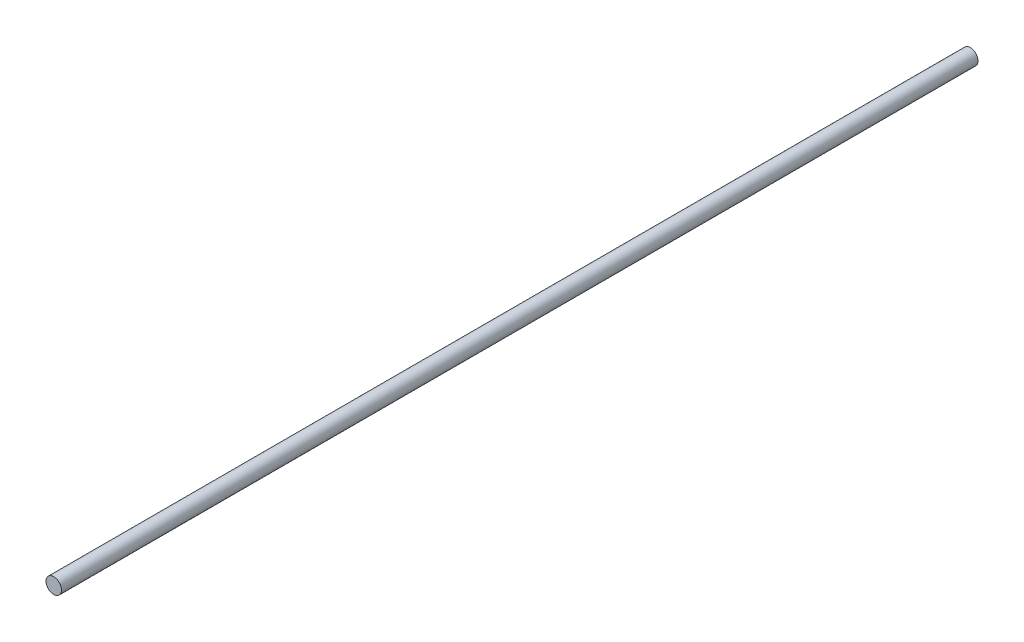
ISO-10303-21;
HEADER;
FILE_DESCRIPTION(('STEP AP214'),'2;1');
FILE_NAME('part.step','',(''),(''),'','','');
FILE_SCHEMA(('AUTOMOTIVE_DESIGN { 1 0 10303 214 1 1 1 1 }'));
ENDSEC;
DATA;
#1=APPLICATION_CONTEXT('core data for automotive mechanical design processes');
#2=APPLICATION_PROTOCOL_DEFINITION('international standard','automotive_design',2000,#1);
#3=PRODUCT_CONTEXT('',#1,'mechanical');
#4=PRODUCT('Part','Part','',(#3));
#5=PRODUCT_RELATED_PRODUCT_CATEGORY('part','',(#4));
#6=PRODUCT_DEFINITION_FORMATION('','',#4);
#7=PRODUCT_DEFINITION_CONTEXT('part definition',#1,'design');
#8=PRODUCT_DEFINITION('design','',#6,#7);
#9=PRODUCT_DEFINITION_SHAPE('','',#8);
#10=(LENGTH_UNIT() NAMED_UNIT(*) SI_UNIT(.MILLI.,.METRE.));
#11=(NAMED_UNIT(*) PLANE_ANGLE_UNIT() SI_UNIT($,.RADIAN.));
#12=(NAMED_UNIT(*) SI_UNIT($,.STERADIAN.) SOLID_ANGLE_UNIT());
#13=UNCERTAINTY_MEASURE_WITH_UNIT(LENGTH_MEASURE(1.E-05),#10,'distance_accuracy_value','');
#14=(GEOMETRIC_REPRESENTATION_CONTEXT(3) GLOBAL_UNCERTAINTY_ASSIGNED_CONTEXT((#13)) GLOBAL_UNIT_ASSIGNED_CONTEXT((#10,
#11,#12)) REPRESENTATION_CONTEXT('',''));
#15=CARTESIAN_POINT('',(0.,0.,0.));
#16=DIRECTION('',(0.,0.,1.));
#17=DIRECTION('',(1.,0.,0.));
#18=AXIS2_PLACEMENT_3D('',#15,#16,#17);
#19=CARTESIAN_POINT('',(0.,0.,475.));
#20=DIRECTION('',(0.,0.,-1.));
#21=DIRECTION('',(-1.,0.,0.));
#22=AXIS2_PLACEMENT_3D('',#19,#20,#21);
#23=CYLINDRICAL_SURFACE('',#22,4.);
#24=CARTESIAN_POINT('',(0.,0.,475.));
#25=DIRECTION('',(0.,0.,1.));
#26=DIRECTION('',(1.,0.,0.));
#27=AXIS2_PLACEMENT_3D('',#24,#25,#26);
#28=CIRCLE('',#27,4.);
#29=CARTESIAN_POINT('',(-4.,0.,475.));
#30=VERTEX_POINT('',#29);
#31=EDGE_CURVE('E10',#30,#30,#28,.T.);
#32=CARTESIAN_POINT('',(0.,0.,0.));
#33=DIRECTION('',(0.,0.,1.));
#34=DIRECTION('',(1.,0.,0.));
#35=AXIS2_PLACEMENT_3D('',#32,#33,#34);
#36=CIRCLE('',#35,4.);
#37=CARTESIAN_POINT('',(-4.,0.,0.));
#38=VERTEX_POINT('',#37);
#39=EDGE_CURVE('E46',#38,#38,#36,.T.);
#40=CARTESIAN_POINT('',(-4.,0.,475.));
#41=CARTESIAN_POINT('',(-4.,0.,470.052083333333));
#42=CARTESIAN_POINT('',(-4.,0.,465.104166666667));
#43=CARTESIAN_POINT('',(-4.,0.,455.208333333333));
#44=CARTESIAN_POINT('',(-4.,0.,450.260416666667));
#45=CARTESIAN_POINT('',(-4.,0.,440.364583333333));
#46=CARTESIAN_POINT('',(-4.,0.,435.416666666667));
#47=CARTESIAN_POINT('',(-4.,0.,425.520833333333));
#48=CARTESIAN_POINT('',(-4.,0.,420.572916666667));
#49=CARTESIAN_POINT('',(-4.,0.,410.677083333333));
#50=CARTESIAN_POINT('',(-4.,0.,405.729166666667));
#51=CARTESIAN_POINT('',(-4.,0.,395.833333333333));
#52=CARTESIAN_POINT('',(-4.,0.,390.885416666667));
#53=CARTESIAN_POINT('',(-4.,0.,380.989583333333));
#54=CARTESIAN_POINT('',(-4.,0.,376.041666666667));
#55=CARTESIAN_POINT('',(-4.,0.,366.145833333333));
#56=CARTESIAN_POINT('',(-4.,0.,361.197916666667));
#57=CARTESIAN_POINT('',(-4.,0.,351.302083333333));
#58=CARTESIAN_POINT('',(-4.,0.,346.354166666667));
#59=CARTESIAN_POINT('',(-4.,0.,336.458333333333));
#60=CARTESIAN_POINT('',(-4.,0.,331.510416666667));
#61=CARTESIAN_POINT('',(-4.,0.,321.614583333333));
#62=CARTESIAN_POINT('',(-4.,0.,316.666666666667));
#63=CARTESIAN_POINT('',(-4.,0.,306.770833333333));
#64=CARTESIAN_POINT('',(-4.,0.,301.822916666667));
#65=CARTESIAN_POINT('',(-4.,0.,291.927083333333));
#66=CARTESIAN_POINT('',(-4.,0.,286.979166666667));
#67=CARTESIAN_POINT('',(-4.,0.,277.083333333333));
#68=CARTESIAN_POINT('',(-4.,0.,272.135416666667));
#69=CARTESIAN_POINT('',(-4.,0.,262.239583333333));
#70=CARTESIAN_POINT('',(-4.,0.,257.291666666667));
#71=CARTESIAN_POINT('',(-4.,0.,247.395833333333));
#72=CARTESIAN_POINT('',(-4.,0.,242.447916666667));
#73=CARTESIAN_POINT('',(-4.,0.,232.552083333333));
#74=CARTESIAN_POINT('',(-4.,0.,227.604166666667));
#75=CARTESIAN_POINT('',(-4.,0.,217.708333333333));
#76=CARTESIAN_POINT('',(-4.,0.,212.760416666667));
#77=CARTESIAN_POINT('',(-4.,0.,202.864583333333));
#78=CARTESIAN_POINT('',(-4.,0.,197.916666666667));
#79=CARTESIAN_POINT('',(-4.,0.,188.020833333333));
#80=CARTESIAN_POINT('',(-4.,0.,183.072916666667));
#81=CARTESIAN_POINT('',(-4.,0.,173.177083333333));
#82=CARTESIAN_POINT('',(-4.,0.,168.229166666667));
#83=CARTESIAN_POINT('',(-4.,0.,158.333333333333));
#84=CARTESIAN_POINT('',(-4.,0.,153.385416666667));
#85=CARTESIAN_POINT('',(-4.,0.,143.489583333333));
#86=CARTESIAN_POINT('',(-4.,0.,138.541666666667));
#87=CARTESIAN_POINT('',(-4.,0.,128.645833333333));
#88=CARTESIAN_POINT('',(-4.,0.,123.697916666667));
#89=CARTESIAN_POINT('',(-4.,0.,113.802083333333));
#90=CARTESIAN_POINT('',(-4.,0.,108.854166666667));
#91=CARTESIAN_POINT('',(-4.,0.,98.9583333333333));
#92=CARTESIAN_POINT('',(-4.,0.,94.0104166666667));
#93=CARTESIAN_POINT('',(-4.,0.,84.1145833333333));
#94=CARTESIAN_POINT('',(-4.,0.,79.1666666666666));
#95=CARTESIAN_POINT('',(-4.,0.,69.2708333333333));
#96=CARTESIAN_POINT('',(-4.,0.,64.3229166666666));
#97=CARTESIAN_POINT('',(-4.,0.,54.4270833333333));
#98=CARTESIAN_POINT('',(-4.,0.,49.4791666666666));
#99=CARTESIAN_POINT('',(-4.,0.,39.5833333333333));
#100=CARTESIAN_POINT('',(-4.,0.,34.6354166666666));
#101=CARTESIAN_POINT('',(-4.,0.,24.7395833333333));
#102=CARTESIAN_POINT('',(-4.,0.,19.7916666666666));
#103=CARTESIAN_POINT('',(-4.,0.,9.89583333333327));
#104=CARTESIAN_POINT('',(-4.,0.,4.9479166666666));
#105=CARTESIAN_POINT('',(-4.,0.,0.));
#106=B_SPLINE_CURVE_WITH_KNOTS('',3,(#40,#41,#42,#43,#44,#45,#46,#47,#48,#49,#50,#51,#52,#53,
#54,#55,#56,#57,#58,#59,#60,#61,#62,#63,#64,#65,#66,#67,#68,#69,#70,#71,#72,#73,#74,#75,#76,#77,
#78,#79,#80,#81,#82,#83,#84,#85,#86,#87,#88,#89,#90,#91,#92,#93,#94,#95,#96,#97,#98,#99,#100,
#101,#102,#103,#104,#105),.UNSPECIFIED.,.F.,.F.,(4,2,2,2,2,2,2,2,2,2,2,2,2,2,2,2,2,2,2,2,2,2,2,
2,2,2,2,2,2,2,2,2,4),(0.,14.84375,29.6875,44.53125,59.375,74.21875,89.0625,103.90625,118.75,
133.59375,148.4375,163.28125,178.125,192.96875,207.8125,222.65625,237.5,252.34375,267.1875,
282.03125,296.875,311.71875,326.5625,341.40625,356.25,371.09375,385.9375,400.78125,415.625,
430.46875,445.3125,460.15625,475.),.UNSPECIFIED.);
#107=EDGE_CURVE('BSEAM43',#30,#38,#106,.T.);
#108=ORIENTED_EDGE('',*,*,#31,.F.);
#109=ORIENTED_EDGE('',*,*,#39,.T.);
#110=ORIENTED_EDGE('',*,*,#107,.T.);
#111=ORIENTED_EDGE('',*,*,#107,.F.);
#112=EDGE_LOOP('',(#108,#110,#109,#111));
#113=FACE_BOUND('',#112,.T.);
#114=ADVANCED_FACE('F43',(#113),#23,.T.);
#115=CARTESIAN_POINT('',(0.,0.,475.));
#116=DIRECTION('',(0.,0.,1.));
#117=DIRECTION('',(1.,0.,0.));
#118=AXIS2_PLACEMENT_3D('',#115,#116,#117);
#119=PLANE('',#118);
#120=ORIENTED_EDGE('',*,*,#31,.T.);
#121=EDGE_LOOP('',(#120));
#122=FACE_BOUND('',#121,.T.);
#123=ADVANCED_FACE('F60',(#122),#119,.T.);
#124=CARTESIAN_POINT('',(0.,0.,0.));
#125=DIRECTION('',(0.,0.,1.));
#126=DIRECTION('',(1.,0.,0.));
#127=AXIS2_PLACEMENT_3D('',#124,#125,#126);
#128=PLANE('',#127);
#129=ORIENTED_EDGE('',*,*,#39,.F.);
#130=EDGE_LOOP('',(#129));
#131=FACE_BOUND('',#130,.T.);
#132=ADVANCED_FACE('F58',(#131),#128,.F.);
#133=CLOSED_SHELL('',(#114,#123,#132));
#134=MANIFOLD_SOLID_BREP('B2',#133);
#135=ADVANCED_BREP_SHAPE_REPRESENTATION('',(#18,#134),#14);
#136=SHAPE_DEFINITION_REPRESENTATION(#9,#135);
ENDSEC;
END-ISO-10303-21;
